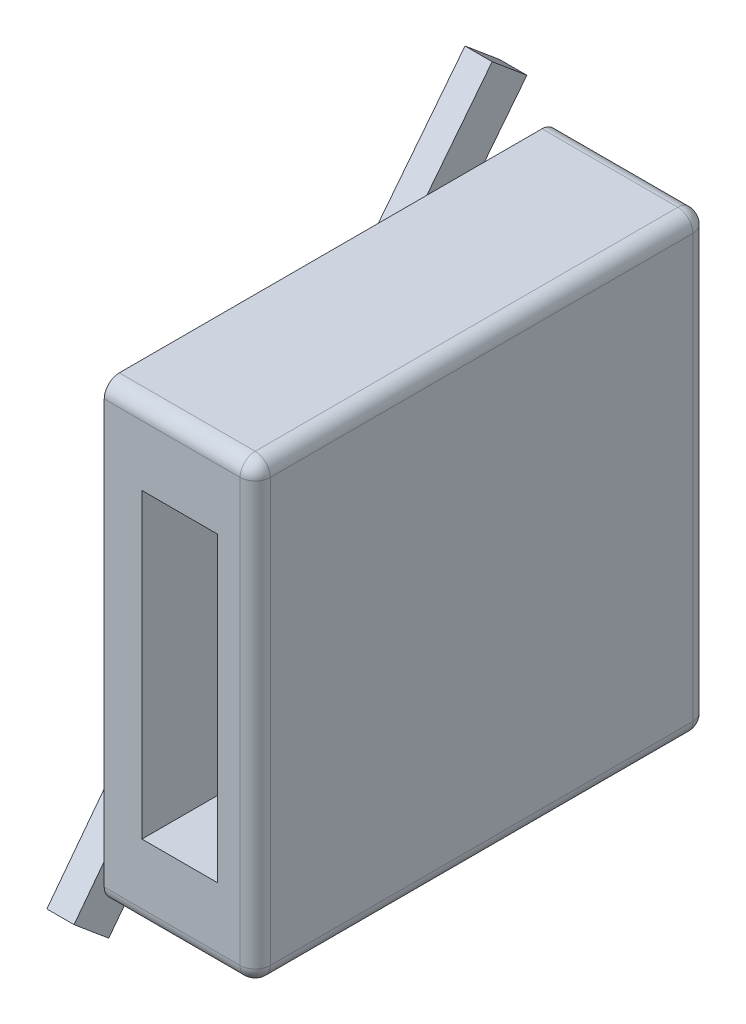
ISO-10303-21;
HEADER;
FILE_DESCRIPTION(('STEP AP214'),'2;1');
FILE_NAME('part.step','',(''),(''),'','','');
FILE_SCHEMA(('AUTOMOTIVE_DESIGN { 1 0 10303 214 1 1 1 1 }'));
ENDSEC;
DATA;
#1=APPLICATION_CONTEXT('core data for automotive mechanical design processes');
#2=APPLICATION_PROTOCOL_DEFINITION('international standard','automotive_design',2000,#1);
#3=PRODUCT_CONTEXT('',#1,'mechanical');
#4=PRODUCT('Part','Part','',(#3));
#5=PRODUCT_RELATED_PRODUCT_CATEGORY('part','',(#4));
#6=PRODUCT_DEFINITION_FORMATION('','',#4);
#7=PRODUCT_DEFINITION_CONTEXT('part definition',#1,'design');
#8=PRODUCT_DEFINITION('design','',#6,#7);
#9=PRODUCT_DEFINITION_SHAPE('','',#8);
#10=(LENGTH_UNIT() NAMED_UNIT(*) SI_UNIT(.MILLI.,.METRE.));
#11=(NAMED_UNIT(*) PLANE_ANGLE_UNIT() SI_UNIT($,.RADIAN.));
#12=(NAMED_UNIT(*) SI_UNIT($,.STERADIAN.) SOLID_ANGLE_UNIT());
#13=UNCERTAINTY_MEASURE_WITH_UNIT(LENGTH_MEASURE(1.E-05),#10,'distance_accuracy_value','');
#14=(GEOMETRIC_REPRESENTATION_CONTEXT(3) GLOBAL_UNCERTAINTY_ASSIGNED_CONTEXT((#13)) GLOBAL_UNIT_ASSIGNED_CONTEXT((#10,
#11,#12)) REPRESENTATION_CONTEXT('',''));
#15=CARTESIAN_POINT('',(0.,0.,0.));
#16=DIRECTION('',(0.,0.,1.));
#17=DIRECTION('',(1.,0.,0.));
#18=AXIS2_PLACEMENT_3D('',#15,#16,#17);
#19=CARTESIAN_POINT('',(-6.,0.,0.));
#20=DIRECTION('',(1.,0.,0.));
#21=DIRECTION('',(0.,0.,-1.));
#22=AXIS2_PLACEMENT_3D('',#19,#20,#21);
#23=CYLINDRICAL_SURFACE('',#22,2.);
#24=DIRECTION('',(1.,0.,0.));
#25=VECTOR('',#24,1.);
#26=CARTESIAN_POINT('',(-3.8,1.97730393267592,0.30044826147661));
#27=LINE('',#26,#25);
#28=CARTESIAN_POINT('',(-3.8,1.97730393267593,0.30044826147661));
#29=VERTEX_POINT('',#28);
#30=CARTESIAN_POINT('',(-2.,1.97730393267593,0.300448261476609));
#31=VERTEX_POINT('',#30);
#32=EDGE_CURVE('E313',#29,#31,#27,.T.);
#33=ORIENTED_EDGE('',*,*,#32,.F.);
#34=CARTESIAN_POINT('',(-3.8,0.,0.));
#35=DIRECTION('',(1.,0.,0.));
#36=DIRECTION('',(0.,0.,-1.));
#37=AXIS2_PLACEMENT_3D('',#34,#35,#36);
#38=CIRCLE('',#37,2.);
#39=CARTESIAN_POINT('',(-3.8,0.0509287765563087,-1.99935145977851));
#40=VERTEX_POINT('',#39);
#41=EDGE_CURVE('E342',#29,#40,#38,.F.);
#42=ORIENTED_EDGE('',*,*,#41,.T.);
#43=DIRECTION('',(1.,0.,0.));
#44=VECTOR('',#43,1.);
#45=CARTESIAN_POINT('',(-3.8,0.0509287765563048,-1.99935145977851));
#46=LINE('',#45,#44);
#47=CARTESIAN_POINT('',(-2.,0.0509287765563048,-1.99935145977851));
#48=VERTEX_POINT('',#47);
#49=EDGE_CURVE('E324',#40,#48,#46,.T.);
#50=ORIENTED_EDGE('',*,*,#49,.T.);
#51=CARTESIAN_POINT('',(-2.,0.,0.));
#52=DIRECTION('',(1.,0.,0.));
#53=DIRECTION('',(0.,0.,-1.));
#54=AXIS2_PLACEMENT_3D('',#51,#52,#53);
#55=CIRCLE('',#54,2.);
#56=EDGE_CURVE('E334',#31,#48,#55,.F.);
#57=ORIENTED_EDGE('',*,*,#56,.F.);
#58=EDGE_LOOP('',(#33,#42,#50,#57));
#59=FACE_BOUND('',#58,.T.);
#60=CARTESIAN_POINT('',(-2.,-1.97730393267593,-0.300448261476609));
#61=VERTEX_POINT('',#60);
#62=CARTESIAN_POINT('',(-2.,-0.0509287765563049,1.99935145977851));
#63=VERTEX_POINT('',#62);
#64=EDGE_CURVE('E338',#61,#63,#55,.F.);
#65=ORIENTED_EDGE('',*,*,#64,.F.);
#66=DIRECTION('',(1.,0.,0.));
#67=VECTOR('',#66,1.);
#68=CARTESIAN_POINT('',(-3.8,-1.97730393267592,-0.30044826147661));
#69=LINE('',#68,#67);
#70=CARTESIAN_POINT('',(-3.8,-1.97730393267593,-0.300448261476609));
#71=VERTEX_POINT('',#70);
#72=EDGE_CURVE('E281',#71,#61,#69,.T.);
#73=ORIENTED_EDGE('',*,*,#72,.F.);
#74=CARTESIAN_POINT('',(-3.8,-0.0509287765563089,1.99935145977851));
#75=VERTEX_POINT('',#74);
#76=EDGE_CURVE('E343',#71,#75,#38,.F.);
#77=ORIENTED_EDGE('',*,*,#76,.T.);
#78=DIRECTION('',(1.,0.,0.));
#79=VECTOR('',#78,1.);
#80=CARTESIAN_POINT('',(-3.8,-0.0509287765563049,1.99935145977851));
#81=LINE('',#80,#79);
#82=EDGE_CURVE('E310',#75,#63,#81,.T.);
#83=ORIENTED_EDGE('',*,*,#82,.T.);
#84=EDGE_LOOP('',(#65,#73,#77,#83));
#85=FACE_BOUND('',#84,.T.);
#86=CARTESIAN_POINT('',(0.,0.,0.));
#87=DIRECTION('',(1.,0.,0.));
#88=DIRECTION('',(0.,0.,-1.));
#89=AXIS2_PLACEMENT_3D('',#86,#87,#88);
#90=CIRCLE('',#89,2.);
#91=CARTESIAN_POINT('',(0.,0.,-2.));
#92=VERTEX_POINT('',#91);
#93=EDGE_CURVE('E306',#92,#92,#90,.T.);
#94=ORIENTED_EDGE('',*,*,#93,.F.);
#95=EDGE_LOOP('',(#94));
#96=FACE_BOUND('',#95,.T.);
#97=CARTESIAN_POINT('',(-6.,0.,0.));
#98=DIRECTION('',(1.,0.,0.));
#99=DIRECTION('',(0.,0.,-1.));
#100=AXIS2_PLACEMENT_3D('',#97,#98,#99);
#101=CIRCLE('',#100,2.);
#102=CARTESIAN_POINT('',(-6.,0.,-2.));
#103=VERTEX_POINT('',#102);
#104=EDGE_CURVE('E330',#103,#103,#101,.T.);
#105=ORIENTED_EDGE('',*,*,#104,.T.);
#106=EDGE_LOOP('',(#105));
#107=FACE_BOUND('',#106,.T.);
#108=ADVANCED_FACE('F40',(#59,#85,#96,#107),#23,.T.);
#109=CARTESIAN_POINT('',(-6.,0.,0.));
#110=DIRECTION('',(1.,0.,0.));
#111=DIRECTION('',(0.,0.,-1.));
#112=AXIS2_PLACEMENT_3D('',#109,#110,#111);
#113=PLANE('',#112);
#114=ORIENTED_EDGE('',*,*,#104,.F.);
#115=EDGE_LOOP('',(#114));
#116=FACE_BOUND('',#115,.T.);
#117=ADVANCED_FACE('F507',(#116),#113,.F.);
#118=CARTESIAN_POINT('',(-3.8,17.1237069787867,-14.3432853738245));
#119=DIRECTION('',(0.,-0.766599907085064,0.642125052039844));
#120=DIRECTION('',(0.,-0.642125052039844,-0.766599907085064));
#121=AXIS2_PLACEMENT_3D('',#118,#119,#120);
#122=PLANE('',#121);
#123=DIRECTION('',(0.,-0.642125052039844,-0.766599907085064));
#124=VECTOR('',#123,1.);
#125=CARTESIAN_POINT('',(-2.,17.1237069787867,-14.3432853738245));
#126=LINE('',#125,#124);
#127=CARTESIAN_POINT('',(-2.,18.5,-12.7002002787448));
#128=VERTEX_POINT('',#127);
#129=CARTESIAN_POINT('',(-2.,16.5736248438805,-15.));
#130=VERTEX_POINT('',#129);
#131=EDGE_CURVE('E289',#128,#130,#126,.T.);
#132=ORIENTED_EDGE('',*,*,#131,.T.);
#133=DIRECTION('',(1.,0.,0.));
#134=VECTOR('',#133,1.);
#135=CARTESIAN_POINT('',(-3.8,16.5736248438805,-15.));
#136=LINE('',#135,#134);
#137=CARTESIAN_POINT('',(-3.8,16.5736248438805,-15.));
#138=VERTEX_POINT('',#137);
#139=EDGE_CURVE('E321',#138,#130,#136,.T.);
#140=ORIENTED_EDGE('',*,*,#139,.F.);
#141=DIRECTION('',(0.,-0.642125052039844,-0.766599907085064));
#142=VECTOR('',#141,1.);
#143=CARTESIAN_POINT('',(-3.8,17.1237069787867,-14.3432853738245));
#144=LINE('',#143,#142);
#145=CARTESIAN_POINT('',(-3.8,18.5,-12.7002002787448));
#146=VERTEX_POINT('',#145);
#147=EDGE_CURVE('E267',#146,#138,#144,.T.);
#148=ORIENTED_EDGE('',*,*,#147,.F.);
#149=DIRECTION('',(1.,0.,0.));
#150=VECTOR('',#149,1.);
#151=CARTESIAN_POINT('',(-3.8,18.5,-12.7002002787448));
#152=LINE('',#151,#150);
#153=EDGE_CURVE('E317',#146,#128,#152,.T.);
#154=ORIENTED_EDGE('',*,*,#153,.T.);
#155=EDGE_LOOP('',(#132,#140,#148,#154));
#156=FACE_BOUND('',#155,.T.);
#157=ADVANCED_FACE('F515',(#156),#122,.F.);
#158=CARTESIAN_POINT('',(-3.8,0.,0.));
#159=DIRECTION('',(1.,0.,0.));
#160=DIRECTION('',(0.,0.,-1.));
#161=AXIS2_PLACEMENT_3D('',#158,#159,#160);
#162=PLANE('',#161);
#163=ORIENTED_EDGE('',*,*,#41,.F.);
#164=DIRECTION('',(0.,0.78588997387051,-0.618366354978834));
#165=VECTOR('',#164,1.);
#166=CARTESIAN_POINT('',(-3.8,0.902083661226397,1.14647004844643));
#167=LINE('',#166,#165);
#168=EDGE_CURVE('E270',#29,#146,#167,.T.);
#169=ORIENTED_EDGE('',*,*,#168,.T.);
#170=ORIENTED_EDGE('',*,*,#147,.T.);
#171=DIRECTION('',(0.,0.78588997387051,-0.618366354978834));
#172=VECTOR('',#171,1.);
#173=CARTESIAN_POINT('',(-3.8,-0.952146677177534,-1.21009579713236));
#174=LINE('',#173,#172);
#175=EDGE_CURVE('E262',#40,#138,#174,.T.);
#176=ORIENTED_EDGE('',*,*,#175,.F.);
#177=EDGE_LOOP('',(#163,#169,#170,#176));
#178=FACE_BOUND('',#177,.T.);
#179=ADVANCED_FACE('F732',(#178),#162,.F.);
#180=CARTESIAN_POINT('',(-2.,0.,0.));
#181=DIRECTION('',(1.,0.,0.));
#182=DIRECTION('',(0.,0.,-1.));
#183=AXIS2_PLACEMENT_3D('',#180,#181,#182);
#184=PLANE('',#183);
#185=DIRECTION('',(0.,0.78588997387051,-0.618366354978834));
#186=VECTOR('',#185,1.);
#187=CARTESIAN_POINT('',(-2.,0.902083661226397,1.14647004844643));
#188=LINE('',#187,#186);
#189=EDGE_CURVE('E293',#31,#128,#188,.T.);
#190=ORIENTED_EDGE('',*,*,#189,.F.);
#191=ORIENTED_EDGE('',*,*,#56,.T.);
#192=DIRECTION('',(0.,0.78588997387051,-0.618366354978834));
#193=VECTOR('',#192,1.);
#194=CARTESIAN_POINT('',(-2.,-0.952146677177534,-1.21009579713236));
#195=LINE('',#194,#193);
#196=EDGE_CURVE('E285',#48,#130,#195,.T.);
#197=ORIENTED_EDGE('',*,*,#196,.T.);
#198=ORIENTED_EDGE('',*,*,#131,.F.);
#199=EDGE_LOOP('',(#190,#191,#197,#198));
#200=FACE_BOUND('',#199,.T.);
#201=ADVANCED_FACE('F722',(#200),#184,.T.);
#202=CARTESIAN_POINT('',(-3.8,-0.952146677177534,-1.21009579713236));
#203=DIRECTION('',(0.,-0.618366354978834,-0.78588997387051));
#204=DIRECTION('',(0.,0.78588997387051,-0.618366354978834));
#205=AXIS2_PLACEMENT_3D('',#202,#203,#204);
#206=PLANE('',#205);
#207=ORIENTED_EDGE('',*,*,#196,.F.);
#208=ORIENTED_EDGE('',*,*,#49,.F.);
#209=ORIENTED_EDGE('',*,*,#175,.T.);
#210=ORIENTED_EDGE('',*,*,#139,.T.);
#211=EDGE_LOOP('',(#207,#208,#209,#210));
#212=FACE_BOUND('',#211,.T.);
#213=ADVANCED_FACE('F739',(#212),#206,.T.);
#214=CARTESIAN_POINT('',(-3.8,0.902083661226397,1.14647004844643));
#215=DIRECTION('',(0.,-0.618366354978834,-0.78588997387051));
#216=DIRECTION('',(0.,0.78588997387051,-0.618366354978834));
#217=AXIS2_PLACEMENT_3D('',#214,#215,#216);
#218=PLANE('',#217);
#219=ORIENTED_EDGE('',*,*,#189,.T.);
#220=ORIENTED_EDGE('',*,*,#153,.F.);
#221=ORIENTED_EDGE('',*,*,#168,.F.);
#222=ORIENTED_EDGE('',*,*,#32,.T.);
#223=EDGE_LOOP('',(#219,#220,#221,#222));
#224=FACE_BOUND('',#223,.T.);
#225=ADVANCED_FACE('F729',(#224),#218,.F.);
#226=ORIENTED_EDGE('',*,*,#76,.F.);
#227=DIRECTION('',(0.,-0.796204023316346,0.60502822517207));
#228=VECTOR('',#227,1.);
#229=CARTESIAN_POINT('',(-3.8,-0.868543914619886,-1.14298495586815));
#230=LINE('',#229,#228);
#231=CARTESIAN_POINT('',(-3.8,-19.0858754716355,12.7002002787449));
#232=VERTEX_POINT('',#231);
#233=EDGE_CURVE('E259',#71,#232,#230,.T.);
#234=ORIENTED_EDGE('',*,*,#233,.T.);
#235=DIRECTION('',(0.,-0.642125052039872,-0.76659990708504));
#236=VECTOR('',#235,1.);
#237=CARTESIAN_POINT('',(-3.8,-17.4680115912076,14.6316843354287));
#238=LINE('',#237,#236);
#239=CARTESIAN_POINT('',(-3.8,-17.1595003155159,15.));
#240=VERTEX_POINT('',#239);
#241=EDGE_CURVE('E277',#240,#232,#238,.T.);
#242=ORIENTED_EDGE('',*,*,#241,.F.);
#243=DIRECTION('',(0.,-0.796204023316346,0.60502822517207));
#244=VECTOR('',#243,1.);
#245=CARTESIAN_POINT('',(-3.8,0.944496450754903,1.24293684626893));
#246=LINE('',#245,#244);
#247=EDGE_CURVE('E273',#75,#240,#246,.T.);
#248=ORIENTED_EDGE('',*,*,#247,.F.);
#249=EDGE_LOOP('',(#226,#234,#242,#248));
#250=FACE_BOUND('',#249,.T.);
#251=ADVANCED_FACE('F719',(#250),#162,.F.);
#252=DIRECTION('',(0.,-0.796204023316346,0.60502822517207));
#253=VECTOR('',#252,1.);
#254=CARTESIAN_POINT('',(-2.,-0.868543914619886,-1.14298495586815));
#255=LINE('',#254,#253);
#256=CARTESIAN_POINT('',(-2.,-19.0858754716355,12.7002002787449));
#257=VERTEX_POINT('',#256);
#258=EDGE_CURVE('E258',#61,#257,#255,.T.);
#259=ORIENTED_EDGE('',*,*,#258,.F.);
#260=ORIENTED_EDGE('',*,*,#64,.T.);
#261=DIRECTION('',(0.,-0.796204023316346,0.60502822517207));
#262=VECTOR('',#261,1.);
#263=CARTESIAN_POINT('',(-2.,0.944496450754903,1.24293684626893));
#264=LINE('',#263,#262);
#265=CARTESIAN_POINT('',(-2.,-17.1595003155159,15.));
#266=VERTEX_POINT('',#265);
#267=EDGE_CURVE('E296',#63,#266,#264,.T.);
#268=ORIENTED_EDGE('',*,*,#267,.T.);
#269=DIRECTION('',(0.,-0.642125052039872,-0.76659990708504));
#270=VECTOR('',#269,1.);
#271=CARTESIAN_POINT('',(-2.,-17.4680115912076,14.6316843354287));
#272=LINE('',#271,#270);
#273=EDGE_CURVE('E263',#266,#257,#272,.T.);
#274=ORIENTED_EDGE('',*,*,#273,.T.);
#275=EDGE_LOOP('',(#259,#260,#268,#274));
#276=FACE_BOUND('',#275,.T.);
#277=ADVANCED_FACE('F711',(#276),#184,.T.);
#278=CARTESIAN_POINT('',(-3.8,-0.868543914619886,-1.14298495586815));
#279=DIRECTION('',(0.,0.60502822517207,0.796204023316345));
#280=DIRECTION('',(0.,-0.796204023316346,0.60502822517207));
#281=AXIS2_PLACEMENT_3D('',#278,#279,#280);
#282=PLANE('',#281);
#283=ORIENTED_EDGE('',*,*,#258,.T.);
#284=DIRECTION('',(1.,0.,0.));
#285=VECTOR('',#284,1.);
#286=CARTESIAN_POINT('',(-3.8,-19.0858754716355,12.7002002787449));
#287=LINE('',#286,#285);
#288=EDGE_CURVE('E303',#232,#257,#287,.T.);
#289=ORIENTED_EDGE('',*,*,#288,.F.);
#290=ORIENTED_EDGE('',*,*,#233,.F.);
#291=ORIENTED_EDGE('',*,*,#72,.T.);
#292=EDGE_LOOP('',(#283,#289,#290,#291));
#293=FACE_BOUND('',#292,.T.);
#294=ADVANCED_FACE('F702',(#293),#282,.F.);
#295=CARTESIAN_POINT('',(-3.8,-17.4680115912076,14.6316843354287));
#296=DIRECTION('',(0.,-0.76659990708504,0.642125052039872));
#297=DIRECTION('',(0.,-0.642125052039872,-0.76659990708504));
#298=AXIS2_PLACEMENT_3D('',#295,#296,#297);
#299=PLANE('',#298);
#300=ORIENTED_EDGE('',*,*,#273,.F.);
#301=DIRECTION('',(1.,0.,0.));
#302=VECTOR('',#301,1.);
#303=CARTESIAN_POINT('',(-3.8,-17.1595003155159,15.));
#304=LINE('',#303,#302);
#305=EDGE_CURVE('E307',#240,#266,#304,.T.);
#306=ORIENTED_EDGE('',*,*,#305,.F.);
#307=ORIENTED_EDGE('',*,*,#241,.T.);
#308=ORIENTED_EDGE('',*,*,#288,.T.);
#309=EDGE_LOOP('',(#300,#306,#307,#308));
#310=FACE_BOUND('',#309,.T.);
#311=ADVANCED_FACE('F693',(#310),#299,.T.);
#312=CARTESIAN_POINT('',(-3.8,0.944496450754903,1.24293684626893));
#313=DIRECTION('',(0.,0.60502822517207,0.796204023316345));
#314=DIRECTION('',(0.,-0.796204023316345,0.60502822517207));
#315=AXIS2_PLACEMENT_3D('',#312,#313,#314);
#316=PLANE('',#315);
#317=ORIENTED_EDGE('',*,*,#267,.F.);
#318=ORIENTED_EDGE('',*,*,#82,.F.);
#319=ORIENTED_EDGE('',*,*,#247,.T.);
#320=ORIENTED_EDGE('',*,*,#305,.T.);
#321=EDGE_LOOP('',(#317,#318,#319,#320));
#322=FACE_BOUND('',#321,.T.);
#323=ADVANCED_FACE('F685',(#322),#316,.T.);
#324=CARTESIAN_POINT('',(10.,-15.,15.));
#325=DIRECTION('',(0.,0.,-1.));
#326=DIRECTION('',(0.,1.,0.));
#327=AXIS2_PLACEMENT_3D('',#324,#325,#326);
#328=PLANE('',#327);
#329=DIRECTION('',(1.,0.,0.));
#330=VECTOR('',#329,1.);
#331=CARTESIAN_POINT('',(7.5,-10.,15.));
#332=LINE('',#331,#330);
#333=CARTESIAN_POINT('',(2.5,-10.,15.));
#334=VERTEX_POINT('',#333);
#335=CARTESIAN_POINT('',(7.5,-10.,15.));
#336=VERTEX_POINT('',#335);
#337=EDGE_CURVE('E229',#334,#336,#332,.T.);
#338=ORIENTED_EDGE('',*,*,#337,.F.);
#339=DIRECTION('',(0.,-1.,0.));
#340=VECTOR('',#339,1.);
#341=CARTESIAN_POINT('',(2.5,-10.,15.));
#342=LINE('',#341,#340);
#343=CARTESIAN_POINT('',(2.5,10.,15.));
#344=VERTEX_POINT('',#343);
#345=EDGE_CURVE('E196',#344,#334,#342,.T.);
#346=ORIENTED_EDGE('',*,*,#345,.F.);
#347=DIRECTION('',(-1.,0.,0.));
#348=VECTOR('',#347,1.);
#349=CARTESIAN_POINT('',(7.5,10.,15.));
#350=LINE('',#349,#348);
#351=CARTESIAN_POINT('',(7.5,10.,15.));
#352=VERTEX_POINT('',#351);
#353=EDGE_CURVE('E216',#352,#344,#350,.T.);
#354=ORIENTED_EDGE('',*,*,#353,.F.);
#355=DIRECTION('',(0.,1.,0.));
#356=VECTOR('',#355,1.);
#357=CARTESIAN_POINT('',(7.5,-10.,15.));
#358=LINE('',#357,#356);
#359=EDGE_CURVE('E220',#336,#352,#358,.T.);
#360=ORIENTED_EDGE('',*,*,#359,.F.);
#361=EDGE_LOOP('',(#338,#346,#354,#360));
#362=FACE_BOUND('',#361,.T.);
#363=DIRECTION('',(0.,-1.,0.));
#364=VECTOR('',#363,1.);
#365=CARTESIAN_POINT('',(9.,15.,15.));
#366=LINE('',#365,#364);
#367=CARTESIAN_POINT('',(9.,-14.,15.));
#368=VERTEX_POINT('',#367);
#369=CARTESIAN_POINT('',(9.,14.,15.));
#370=VERTEX_POINT('',#369);
#371=EDGE_CURVE('E346',#368,#370,#366,.F.);
#372=ORIENTED_EDGE('',*,*,#371,.T.);
#373=DIRECTION('',(-1.,0.,0.));
#374=VECTOR('',#373,1.);
#375=CARTESIAN_POINT('',(10.,14.,15.));
#376=LINE('',#375,#374);
#377=CARTESIAN_POINT('',(0.,14.,15.));
#378=VERTEX_POINT('',#377);
#379=EDGE_CURVE('E352',#370,#378,#376,.T.);
#380=ORIENTED_EDGE('',*,*,#379,.T.);
#381=DIRECTION('',(0.,-1.,0.));
#382=VECTOR('',#381,1.);
#383=CARTESIAN_POINT('',(0.,-15.,15.));
#384=LINE('',#383,#382);
#385=CARTESIAN_POINT('',(0.,-14.,15.));
#386=VERTEX_POINT('',#385);
#387=EDGE_CURVE('E238',#378,#386,#384,.T.);
#388=ORIENTED_EDGE('',*,*,#387,.T.);
#389=DIRECTION('',(-1.,0.,0.));
#390=VECTOR('',#389,1.);
#391=CARTESIAN_POINT('',(10.,-14.,15.));
#392=LINE('',#391,#390);
#393=EDGE_CURVE('E349',#386,#368,#392,.F.);
#394=ORIENTED_EDGE('',*,*,#393,.T.);
#395=EDGE_LOOP('',(#372,#380,#388,#394));
#396=FACE_BOUND('',#395,.T.);
#397=ADVANCED_FACE('F678',(#362,#396),#328,.F.);
#398=CARTESIAN_POINT('',(10.,-15.,-15.));
#399=DIRECTION('',(0.,1.,0.));
#400=DIRECTION('',(0.,0.,1.));
#401=AXIS2_PLACEMENT_3D('',#398,#399,#400);
#402=PLANE('',#401);
#403=DIRECTION('',(0.,0.,-1.));
#404=VECTOR('',#403,1.);
#405=CARTESIAN_POINT('',(0.,-15.,-15.));
#406=LINE('',#405,#404);
#407=CARTESIAN_POINT('',(0.,-15.,14.));
#408=VERTEX_POINT('',#407);
#409=CARTESIAN_POINT('',(0.,-15.,-14.));
#410=VERTEX_POINT('',#409);
#411=EDGE_CURVE('E247',#408,#410,#406,.T.);
#412=ORIENTED_EDGE('',*,*,#411,.T.);
#413=DIRECTION('',(-1.,0.,0.));
#414=VECTOR('',#413,1.);
#415=CARTESIAN_POINT('',(10.,-15.,-14.));
#416=LINE('',#415,#414);
#417=CARTESIAN_POINT('',(9.,-15.,-14.));
#418=VERTEX_POINT('',#417);
#419=EDGE_CURVE('E11',#410,#418,#416,.F.);
#420=ORIENTED_EDGE('',*,*,#419,.T.);
#421=DIRECTION('',(0.,0.,-1.));
#422=VECTOR('',#421,1.);
#423=CARTESIAN_POINT('',(9.,-15.,15.));
#424=LINE('',#423,#422);
#425=CARTESIAN_POINT('',(9.,-15.,14.));
#426=VERTEX_POINT('',#425);
#427=EDGE_CURVE('E50',#418,#426,#424,.F.);
#428=ORIENTED_EDGE('',*,*,#427,.T.);
#429=DIRECTION('',(-1.,0.,0.));
#430=VECTOR('',#429,1.);
#431=CARTESIAN_POINT('',(10.,-15.,14.));
#432=LINE('',#431,#430);
#433=EDGE_CURVE('E399',#426,#408,#432,.T.);
#434=ORIENTED_EDGE('',*,*,#433,.T.);
#435=EDGE_LOOP('',(#412,#420,#428,#434));
#436=FACE_BOUND('',#435,.T.);
#437=ADVANCED_FACE('F670',(#436),#402,.F.);
#438=CARTESIAN_POINT('',(10.,-15.,-15.));
#439=DIRECTION('',(0.,0.,1.));
#440=DIRECTION('',(1.,0.,0.));
#441=AXIS2_PLACEMENT_3D('',#438,#439,#440);
#442=PLANE('',#441);
#443=DIRECTION('',(0.,1.,0.));
#444=VECTOR('',#443,1.);
#445=CARTESIAN_POINT('',(0.,-15.,-15.));
#446=LINE('',#445,#444);
#447=CARTESIAN_POINT('',(0.,-14.,-15.));
#448=VERTEX_POINT('',#447);
#449=CARTESIAN_POINT('',(0.,14.,-15.));
#450=VERTEX_POINT('',#449);
#451=EDGE_CURVE('E250',#448,#450,#446,.T.);
#452=ORIENTED_EDGE('',*,*,#451,.T.);
#453=DIRECTION('',(-1.,0.,0.));
#454=VECTOR('',#453,1.);
#455=CARTESIAN_POINT('',(10.,14.,-15.));
#456=LINE('',#455,#454);
#457=CARTESIAN_POINT('',(9.,14.,-15.));
#458=VERTEX_POINT('',#457);
#459=EDGE_CURVE('E383',#450,#458,#456,.F.);
#460=ORIENTED_EDGE('',*,*,#459,.T.);
#461=DIRECTION('',(0.,1.,0.));
#462=VECTOR('',#461,1.);
#463=CARTESIAN_POINT('',(9.,-15.,-15.));
#464=LINE('',#463,#462);
#465=CARTESIAN_POINT('',(9.,-14.,-15.));
#466=VERTEX_POINT('',#465);
#467=EDGE_CURVE('E377',#458,#466,#464,.F.);
#468=ORIENTED_EDGE('',*,*,#467,.T.);
#469=DIRECTION('',(-1.,0.,0.));
#470=VECTOR('',#469,1.);
#471=CARTESIAN_POINT('',(10.,-14.,-15.));
#472=LINE('',#471,#470);
#473=EDGE_CURVE('E380',#466,#448,#472,.T.);
#474=ORIENTED_EDGE('',*,*,#473,.T.);
#475=EDGE_LOOP('',(#452,#460,#468,#474));
#476=FACE_BOUND('',#475,.T.);
#477=DIRECTION('',(-1.,0.,0.));
#478=VECTOR('',#477,1.);
#479=CARTESIAN_POINT('',(7.5,10.,-15.));
#480=LINE('',#479,#478);
#481=CARTESIAN_POINT('',(7.5,10.,-15.));
#482=VERTEX_POINT('',#481);
#483=CARTESIAN_POINT('',(2.5,10.,-15.));
#484=VERTEX_POINT('',#483);
#485=EDGE_CURVE('E202',#482,#484,#480,.T.);
#486=ORIENTED_EDGE('',*,*,#485,.T.);
#487=DIRECTION('',(0.,-1.,0.));
#488=VECTOR('',#487,1.);
#489=CARTESIAN_POINT('',(2.5,-10.,-15.));
#490=LINE('',#489,#488);
#491=CARTESIAN_POINT('',(2.5,-10.,-15.));
#492=VERTEX_POINT('',#491);
#493=EDGE_CURVE('E193',#484,#492,#490,.T.);
#494=ORIENTED_EDGE('',*,*,#493,.T.);
#495=DIRECTION('',(1.,0.,0.));
#496=VECTOR('',#495,1.);
#497=CARTESIAN_POINT('',(7.5,-10.,-15.));
#498=LINE('',#497,#496);
#499=CARTESIAN_POINT('',(7.5,-10.,-15.));
#500=VERTEX_POINT('',#499);
#501=EDGE_CURVE('E206',#492,#500,#498,.T.);
#502=ORIENTED_EDGE('',*,*,#501,.T.);
#503=DIRECTION('',(0.,1.,0.));
#504=VECTOR('',#503,1.);
#505=CARTESIAN_POINT('',(7.5,-10.,-15.));
#506=LINE('',#505,#504);
#507=EDGE_CURVE('E211',#500,#482,#506,.T.);
#508=ORIENTED_EDGE('',*,*,#507,.T.);
#509=EDGE_LOOP('',(#486,#494,#502,#508));
#510=FACE_BOUND('',#509,.T.);
#511=ADVANCED_FACE('F213',(#476,#510),#442,.F.);
#512=CARTESIAN_POINT('',(10.,15.,-15.));
#513=DIRECTION('',(0.,-1.,0.));
#514=DIRECTION('',(0.,0.,-1.));
#515=AXIS2_PLACEMENT_3D('',#512,#513,#514);
#516=PLANE('',#515);
#517=DIRECTION('',(0.,0.,1.));
#518=VECTOR('',#517,1.);
#519=CARTESIAN_POINT('',(0.,15.,-15.));
#520=LINE('',#519,#518);
#521=CARTESIAN_POINT('',(0.,15.,-14.));
#522=VERTEX_POINT('',#521);
#523=CARTESIAN_POINT('',(0.,15.,14.));
#524=VERTEX_POINT('',#523);
#525=EDGE_CURVE('E254',#522,#524,#520,.T.);
#526=ORIENTED_EDGE('',*,*,#525,.T.);
#527=DIRECTION('',(-1.,0.,0.));
#528=VECTOR('',#527,1.);
#529=CARTESIAN_POINT('',(10.,15.,14.));
#530=LINE('',#529,#528);
#531=CARTESIAN_POINT('',(9.,15.,14.));
#532=VERTEX_POINT('',#531);
#533=EDGE_CURVE('E374',#524,#532,#530,.F.);
#534=ORIENTED_EDGE('',*,*,#533,.T.);
#535=DIRECTION('',(0.,0.,1.));
#536=VECTOR('',#535,1.);
#537=CARTESIAN_POINT('',(9.,15.,-15.));
#538=LINE('',#537,#536);
#539=CARTESIAN_POINT('',(9.,15.,-14.));
#540=VERTEX_POINT('',#539);
#541=EDGE_CURVE('E368',#532,#540,#538,.F.);
#542=ORIENTED_EDGE('',*,*,#541,.T.);
#543=DIRECTION('',(-1.,0.,0.));
#544=VECTOR('',#543,1.);
#545=CARTESIAN_POINT('',(10.,15.,-14.));
#546=LINE('',#545,#544);
#547=EDGE_CURVE('E371',#540,#522,#546,.T.);
#548=ORIENTED_EDGE('',*,*,#547,.T.);
#549=EDGE_LOOP('',(#526,#534,#542,#548));
#550=FACE_BOUND('',#549,.T.);
#551=ADVANCED_FACE('F654',(#550),#516,.F.);
#552=CARTESIAN_POINT('',(10.,0.,0.));
#553=DIRECTION('',(1.,0.,0.));
#554=DIRECTION('',(0.,0.,-1.));
#555=AXIS2_PLACEMENT_3D('',#552,#553,#554);
#556=PLANE('',#555);
#557=DIRECTION('',(0.,-1.,0.));
#558=VECTOR('',#557,1.);
#559=CARTESIAN_POINT('',(10.,-15.,14.));
#560=LINE('',#559,#558);
#561=CARTESIAN_POINT('',(10.,14.,14.));
#562=VERTEX_POINT('',#561);
#563=CARTESIAN_POINT('',(10.,-14.,14.));
#564=VERTEX_POINT('',#563);
#565=EDGE_CURVE('E389',#562,#564,#560,.T.);
#566=ORIENTED_EDGE('',*,*,#565,.T.);
#567=DIRECTION('',(0.,0.,-1.));
#568=VECTOR('',#567,1.);
#569=CARTESIAN_POINT('',(10.,-14.,-15.));
#570=LINE('',#569,#568);
#571=CARTESIAN_POINT('',(10.,-14.,-14.));
#572=VERTEX_POINT('',#571);
#573=EDGE_CURVE('E395',#564,#572,#570,.T.);
#574=ORIENTED_EDGE('',*,*,#573,.T.);
#575=DIRECTION('',(0.,1.,0.));
#576=VECTOR('',#575,1.);
#577=CARTESIAN_POINT('',(10.,15.,-14.));
#578=LINE('',#577,#576);
#579=CARTESIAN_POINT('',(10.,14.,-14.));
#580=VERTEX_POINT('',#579);
#581=EDGE_CURVE('E392',#572,#580,#578,.T.);
#582=ORIENTED_EDGE('',*,*,#581,.T.);
#583=DIRECTION('',(0.,0.,1.));
#584=VECTOR('',#583,1.);
#585=CARTESIAN_POINT('',(10.,14.,15.));
#586=LINE('',#585,#584);
#587=EDGE_CURVE('E386',#580,#562,#586,.T.);
#588=ORIENTED_EDGE('',*,*,#587,.T.);
#589=EDGE_LOOP('',(#566,#574,#582,#588));
#590=FACE_BOUND('',#589,.T.);
#591=ADVANCED_FACE('F482',(#590),#556,.T.);
#592=CARTESIAN_POINT('',(0.,0.,0.));
#593=DIRECTION('',(1.,0.,0.));
#594=DIRECTION('',(0.,0.,-1.));
#595=AXIS2_PLACEMENT_3D('',#592,#593,#594);
#596=PLANE('',#595);
#597=ORIENTED_EDGE('',*,*,#93,.T.);
#598=EDGE_LOOP('',(#597));
#599=FACE_BOUND('',#598,.T.);
#600=ORIENTED_EDGE('',*,*,#387,.F.);
#601=CARTESIAN_POINT('',(0.,14.,14.));
#602=DIRECTION('',(1.,0.,0.));
#603=DIRECTION('',(0.,0.,-1.));
#604=AXIS2_PLACEMENT_3D('',#601,#602,#603);
#605=CIRCLE('',#604,1.);
#606=EDGE_CURVE('E365',#378,#524,#605,.F.);
#607=ORIENTED_EDGE('',*,*,#606,.T.);
#608=ORIENTED_EDGE('',*,*,#525,.F.);
#609=CARTESIAN_POINT('',(0.,14.,-14.));
#610=DIRECTION('',(1.,0.,0.));
#611=DIRECTION('',(0.,0.,-1.));
#612=AXIS2_PLACEMENT_3D('',#609,#610,#611);
#613=CIRCLE('',#612,1.);
#614=EDGE_CURVE('E362',#522,#450,#613,.F.);
#615=ORIENTED_EDGE('',*,*,#614,.T.);
#616=ORIENTED_EDGE('',*,*,#451,.F.);
#617=CARTESIAN_POINT('',(0.,-14.,-14.));
#618=DIRECTION('',(1.,0.,0.));
#619=DIRECTION('',(0.,0.,-1.));
#620=AXIS2_PLACEMENT_3D('',#617,#618,#619);
#621=CIRCLE('',#620,1.);
#622=EDGE_CURVE('E359',#448,#410,#621,.F.);
#623=ORIENTED_EDGE('',*,*,#622,.T.);
#624=ORIENTED_EDGE('',*,*,#411,.F.);
#625=CARTESIAN_POINT('',(0.,-14.,14.));
#626=DIRECTION('',(1.,0.,0.));
#627=DIRECTION('',(0.,0.,-1.));
#628=AXIS2_PLACEMENT_3D('',#625,#626,#627);
#629=CIRCLE('',#628,1.);
#630=EDGE_CURVE('E356',#408,#386,#629,.F.);
#631=ORIENTED_EDGE('',*,*,#630,.T.);
#632=EDGE_LOOP('',(#600,#607,#608,#615,#616,#623,#624,#631));
#633=FACE_BOUND('',#632,.T.);
#634=ADVANCED_FACE('F462',(#599,#633),#596,.F.);
#635=CARTESIAN_POINT('',(2.5,-10.,-15.));
#636=DIRECTION('',(-1.,0.,0.));
#637=DIRECTION('',(0.,0.,1.));
#638=AXIS2_PLACEMENT_3D('',#635,#636,#637);
#639=PLANE('',#638);
#640=ORIENTED_EDGE('',*,*,#345,.T.);
#641=DIRECTION('',(0.,0.,1.));
#642=VECTOR('',#641,1.);
#643=CARTESIAN_POINT('',(2.5,-10.,-15.));
#644=LINE('',#643,#642);
#645=EDGE_CURVE('E189',#492,#334,#644,.T.);
#646=ORIENTED_EDGE('',*,*,#645,.F.);
#647=ORIENTED_EDGE('',*,*,#493,.F.);
#648=DIRECTION('',(0.,0.,1.));
#649=VECTOR('',#648,1.);
#650=CARTESIAN_POINT('',(2.5,10.,-15.));
#651=LINE('',#650,#649);
#652=EDGE_CURVE('E235',#484,#344,#651,.T.);
#653=ORIENTED_EDGE('',*,*,#652,.T.);
#654=EDGE_LOOP('',(#640,#646,#647,#653));
#655=FACE_BOUND('',#654,.T.);
#656=ADVANCED_FACE('F191',(#655),#639,.F.);
#657=CARTESIAN_POINT('',(7.5,10.,-15.));
#658=DIRECTION('',(0.,1.,0.));
#659=DIRECTION('',(-1.,0.,0.));
#660=AXIS2_PLACEMENT_3D('',#657,#658,#659);
#661=PLANE('',#660);
#662=ORIENTED_EDGE('',*,*,#353,.T.);
#663=ORIENTED_EDGE('',*,*,#652,.F.);
#664=ORIENTED_EDGE('',*,*,#485,.F.);
#665=DIRECTION('',(0.,0.,1.));
#666=VECTOR('',#665,1.);
#667=CARTESIAN_POINT('',(7.5,10.,-15.));
#668=LINE('',#667,#666);
#669=EDGE_CURVE('E239',#482,#352,#668,.T.);
#670=ORIENTED_EDGE('',*,*,#669,.T.);
#671=EDGE_LOOP('',(#662,#663,#664,#670));
#672=FACE_BOUND('',#671,.T.);
#673=ADVANCED_FACE('F622',(#672),#661,.F.);
#674=CARTESIAN_POINT('',(7.5,-10.,-15.));
#675=DIRECTION('',(1.,0.,0.));
#676=DIRECTION('',(0.,0.,-1.));
#677=AXIS2_PLACEMENT_3D('',#674,#675,#676);
#678=PLANE('',#677);
#679=ORIENTED_EDGE('',*,*,#359,.T.);
#680=ORIENTED_EDGE('',*,*,#669,.F.);
#681=ORIENTED_EDGE('',*,*,#507,.F.);
#682=DIRECTION('',(0.,0.,1.));
#683=VECTOR('',#682,1.);
#684=CARTESIAN_POINT('',(7.5,-10.,-15.));
#685=LINE('',#684,#683);
#686=EDGE_CURVE('E201',#500,#336,#685,.T.);
#687=ORIENTED_EDGE('',*,*,#686,.T.);
#688=EDGE_LOOP('',(#679,#680,#681,#687));
#689=FACE_BOUND('',#688,.T.);
#690=ADVANCED_FACE('F613',(#689),#678,.F.);
#691=CARTESIAN_POINT('',(7.5,-10.,-15.));
#692=DIRECTION('',(0.,-1.,0.));
#693=DIRECTION('',(0.,0.,-1.));
#694=AXIS2_PLACEMENT_3D('',#691,#692,#693);
#695=PLANE('',#694);
#696=ORIENTED_EDGE('',*,*,#337,.T.);
#697=ORIENTED_EDGE('',*,*,#686,.F.);
#698=ORIENTED_EDGE('',*,*,#501,.F.);
#699=ORIENTED_EDGE('',*,*,#645,.T.);
#700=EDGE_LOOP('',(#696,#697,#698,#699));
#701=FACE_BOUND('',#700,.T.);
#702=ADVANCED_FACE('F207',(#701),#695,.F.);
#703=CARTESIAN_POINT('',(10.,-14.,-14.));
#704=DIRECTION('',(-1.,0.,0.));
#705=DIRECTION('',(0.,0.,1.));
#706=AXIS2_PLACEMENT_3D('',#703,#704,#705);
#707=CYLINDRICAL_SURFACE('',#706,1.);
#708=CARTESIAN_POINT('',(9.,-14.,-14.));
#709=DIRECTION('',(1.,0.,0.));
#710=DIRECTION('',(0.,0.,-1.));
#711=AXIS2_PLACEMENT_3D('',#708,#709,#710);
#712=CIRCLE('',#711,1.);
#713=EDGE_CURVE('E44',#418,#466,#712,.T.);
#714=ORIENTED_EDGE('',*,*,#713,.F.);
#715=ORIENTED_EDGE('',*,*,#419,.F.);
#716=ORIENTED_EDGE('',*,*,#622,.F.);
#717=ORIENTED_EDGE('',*,*,#473,.F.);
#718=EDGE_LOOP('',(#714,#715,#716,#717));
#719=FACE_BOUND('',#718,.T.);
#720=ADVANCED_FACE('F42',(#719),#707,.T.);
#721=CARTESIAN_POINT('',(9.,-14.,-14.));
#722=DIRECTION('',(0.,0.,1.));
#723=DIRECTION('',(1.,0.,0.));
#724=AXIS2_PLACEMENT_3D('',#721,#722,#723);
#725=SPHERICAL_SURFACE('',#724,1.);
#726=CARTESIAN_POINT('',(9.,-14.,-14.));
#727=DIRECTION('',(0.,0.,-1.));
#728=DIRECTION('',(-1.,0.,0.));
#729=AXIS2_PLACEMENT_3D('',#726,#727,#728);
#730=CIRCLE('',#729,1.);
#731=EDGE_CURVE('E440',#418,#572,#730,.F.);
#732=ORIENTED_EDGE('',*,*,#731,.F.);
#733=ORIENTED_EDGE('',*,*,#713,.T.);
#734=CARTESIAN_POINT('',(9.,-14.,-14.));
#735=DIRECTION('',(0.,-1.,0.));
#736=DIRECTION('',(0.,0.,-1.));
#737=AXIS2_PLACEMENT_3D('',#734,#735,#736);
#738=CIRCLE('',#737,1.);
#739=EDGE_CURVE('E443',#572,#466,#738,.F.);
#740=ORIENTED_EDGE('',*,*,#739,.F.);
#741=EDGE_LOOP('',(#732,#733,#740));
#742=FACE_BOUND('',#741,.T.);
#743=ADVANCED_FACE('F453',(#742),#725,.T.);
#744=CARTESIAN_POINT('',(10.,14.,-14.));
#745=DIRECTION('',(-1.,0.,0.));
#746=DIRECTION('',(0.,0.,1.));
#747=AXIS2_PLACEMENT_3D('',#744,#745,#746);
#748=CYLINDRICAL_SURFACE('',#747,1.);
#749=ORIENTED_EDGE('',*,*,#614,.F.);
#750=ORIENTED_EDGE('',*,*,#547,.F.);
#751=CARTESIAN_POINT('',(9.,14.,-14.));
#752=DIRECTION('',(1.,0.,0.));
#753=DIRECTION('',(0.,0.,-1.));
#754=AXIS2_PLACEMENT_3D('',#751,#752,#753);
#755=CIRCLE('',#754,1.);
#756=EDGE_CURVE('E436',#458,#540,#755,.T.);
#757=ORIENTED_EDGE('',*,*,#756,.F.);
#758=ORIENTED_EDGE('',*,*,#459,.F.);
#759=EDGE_LOOP('',(#749,#750,#757,#758));
#760=FACE_BOUND('',#759,.T.);
#761=ADVANCED_FACE('F468',(#760),#748,.T.);
#762=CARTESIAN_POINT('',(9.,0.,-14.));
#763=DIRECTION('',(0.,-1.,0.));
#764=DIRECTION('',(0.,0.,-1.));
#765=AXIS2_PLACEMENT_3D('',#762,#763,#764);
#766=CYLINDRICAL_SURFACE('',#765,1.);
#767=ORIENTED_EDGE('',*,*,#739,.T.);
#768=ORIENTED_EDGE('',*,*,#467,.F.);
#769=CARTESIAN_POINT('',(9.,14.,-14.));
#770=DIRECTION('',(0.,1.,0.));
#771=DIRECTION('',(0.,0.,1.));
#772=AXIS2_PLACEMENT_3D('',#769,#770,#771);
#773=CIRCLE('',#772,1.);
#774=EDGE_CURVE('E432',#580,#458,#773,.T.);
#775=ORIENTED_EDGE('',*,*,#774,.F.);
#776=ORIENTED_EDGE('',*,*,#581,.F.);
#777=EDGE_LOOP('',(#767,#768,#775,#776));
#778=FACE_BOUND('',#777,.T.);
#779=ADVANCED_FACE('F471',(#778),#766,.T.);
#780=CARTESIAN_POINT('',(9.,-14.,0.));
#781=DIRECTION('',(0.,0.,1.));
#782=DIRECTION('',(0.,-1.,0.));
#783=AXIS2_PLACEMENT_3D('',#780,#781,#782);
#784=CYLINDRICAL_SURFACE('',#783,1.);
#785=ORIENTED_EDGE('',*,*,#731,.T.);
#786=ORIENTED_EDGE('',*,*,#573,.F.);
#787=CARTESIAN_POINT('',(9.,-14.,14.));
#788=DIRECTION('',(0.,0.,1.));
#789=DIRECTION('',(1.,0.,0.));
#790=AXIS2_PLACEMENT_3D('',#787,#788,#789);
#791=CIRCLE('',#790,1.);
#792=EDGE_CURVE('E428',#426,#564,#791,.T.);
#793=ORIENTED_EDGE('',*,*,#792,.F.);
#794=ORIENTED_EDGE('',*,*,#427,.F.);
#795=EDGE_LOOP('',(#785,#786,#793,#794));
#796=FACE_BOUND('',#795,.T.);
#797=ADVANCED_FACE('F495',(#796),#784,.T.);
#798=CARTESIAN_POINT('',(10.,-14.,14.));
#799=DIRECTION('',(-1.,0.,0.));
#800=DIRECTION('',(0.,0.,1.));
#801=AXIS2_PLACEMENT_3D('',#798,#799,#800);
#802=CYLINDRICAL_SURFACE('',#801,1.);
#803=ORIENTED_EDGE('',*,*,#630,.F.);
#804=ORIENTED_EDGE('',*,*,#433,.F.);
#805=CARTESIAN_POINT('',(9.,-14.,14.));
#806=DIRECTION('',(1.,0.,0.));
#807=DIRECTION('',(0.,0.,-1.));
#808=AXIS2_PLACEMENT_3D('',#805,#806,#807);
#809=CIRCLE('',#808,1.);
#810=EDGE_CURVE('E424',#368,#426,#809,.T.);
#811=ORIENTED_EDGE('',*,*,#810,.F.);
#812=ORIENTED_EDGE('',*,*,#393,.F.);
#813=EDGE_LOOP('',(#803,#804,#811,#812));
#814=FACE_BOUND('',#813,.T.);
#815=ADVANCED_FACE('F497',(#814),#802,.T.);
#816=CARTESIAN_POINT('',(9.,14.,-14.));
#817=DIRECTION('',(0.,0.,1.));
#818=DIRECTION('',(1.,0.,0.));
#819=AXIS2_PLACEMENT_3D('',#816,#817,#818);
#820=SPHERICAL_SURFACE('',#819,1.);
#821=ORIENTED_EDGE('',*,*,#774,.T.);
#822=ORIENTED_EDGE('',*,*,#756,.T.);
#823=CARTESIAN_POINT('',(9.,14.,-14.));
#824=DIRECTION('',(0.,0.,-1.));
#825=DIRECTION('',(-1.,0.,0.));
#826=AXIS2_PLACEMENT_3D('',#823,#824,#825);
#827=CIRCLE('',#826,1.);
#828=EDGE_CURVE('E420',#580,#540,#827,.F.);
#829=ORIENTED_EDGE('',*,*,#828,.F.);
#830=EDGE_LOOP('',(#821,#822,#829));
#831=FACE_BOUND('',#830,.T.);
#832=ADVANCED_FACE('F475',(#831),#820,.T.);
#833=CARTESIAN_POINT('',(9.,-14.,14.));
#834=DIRECTION('',(0.,0.,1.));
#835=DIRECTION('',(1.,0.,0.));
#836=AXIS2_PLACEMENT_3D('',#833,#834,#835);
#837=SPHERICAL_SURFACE('',#836,1.);
#838=ORIENTED_EDGE('',*,*,#810,.T.);
#839=ORIENTED_EDGE('',*,*,#792,.T.);
#840=CARTESIAN_POINT('',(9.,-14.,14.));
#841=DIRECTION('',(0.,-1.,0.));
#842=DIRECTION('',(0.,0.,-1.));
#843=AXIS2_PLACEMENT_3D('',#840,#841,#842);
#844=CIRCLE('',#843,1.);
#845=EDGE_CURVE('E416',#368,#564,#844,.F.);
#846=ORIENTED_EDGE('',*,*,#845,.F.);
#847=EDGE_LOOP('',(#838,#839,#846));
#848=FACE_BOUND('',#847,.T.);
#849=ADVANCED_FACE('F491',(#848),#837,.T.);
#850=CARTESIAN_POINT('',(9.,14.,0.));
#851=DIRECTION('',(0.,0.,-1.));
#852=DIRECTION('',(0.,1.,0.));
#853=AXIS2_PLACEMENT_3D('',#850,#851,#852);
#854=CYLINDRICAL_SURFACE('',#853,1.);
#855=ORIENTED_EDGE('',*,*,#828,.T.);
#856=ORIENTED_EDGE('',*,*,#541,.F.);
#857=CARTESIAN_POINT('',(9.,14.,14.));
#858=DIRECTION('',(0.,0.,1.));
#859=DIRECTION('',(1.,0.,0.));
#860=AXIS2_PLACEMENT_3D('',#857,#858,#859);
#861=CIRCLE('',#860,1.);
#862=EDGE_CURVE('E412',#562,#532,#861,.T.);
#863=ORIENTED_EDGE('',*,*,#862,.F.);
#864=ORIENTED_EDGE('',*,*,#587,.F.);
#865=EDGE_LOOP('',(#855,#856,#863,#864));
#866=FACE_BOUND('',#865,.T.);
#867=ADVANCED_FACE('F479',(#866),#854,.T.);
#868=CARTESIAN_POINT('',(9.,0.,14.));
#869=DIRECTION('',(0.,1.,0.));
#870=DIRECTION('',(0.,0.,1.));
#871=AXIS2_PLACEMENT_3D('',#868,#869,#870);
#872=CYLINDRICAL_SURFACE('',#871,1.);
#873=ORIENTED_EDGE('',*,*,#845,.T.);
#874=ORIENTED_EDGE('',*,*,#565,.F.);
#875=CARTESIAN_POINT('',(9.,14.,14.));
#876=DIRECTION('',(0.,1.,0.));
#877=DIRECTION('',(-1.,0.,0.));
#878=AXIS2_PLACEMENT_3D('',#875,#876,#877);
#879=CIRCLE('',#878,1.);
#880=EDGE_CURVE('E408',#370,#562,#879,.T.);
#881=ORIENTED_EDGE('',*,*,#880,.F.);
#882=ORIENTED_EDGE('',*,*,#371,.F.);
#883=EDGE_LOOP('',(#873,#874,#881,#882));
#884=FACE_BOUND('',#883,.T.);
#885=ADVANCED_FACE('F486',(#884),#872,.T.);
#886=CARTESIAN_POINT('',(9.,14.,14.));
#887=DIRECTION('',(0.,0.,1.));
#888=DIRECTION('',(1.,0.,0.));
#889=AXIS2_PLACEMENT_3D('',#886,#887,#888);
#890=SPHERICAL_SURFACE('',#889,1.);
#891=ORIENTED_EDGE('',*,*,#880,.T.);
#892=ORIENTED_EDGE('',*,*,#862,.T.);
#893=CARTESIAN_POINT('',(9.,14.,14.));
#894=DIRECTION('',(1.,0.,0.));
#895=DIRECTION('',(0.,0.,-1.));
#896=AXIS2_PLACEMENT_3D('',#893,#894,#895);
#897=CIRCLE('',#896,1.);
#898=EDGE_CURVE('E404',#370,#532,#897,.F.);
#899=ORIENTED_EDGE('',*,*,#898,.F.);
#900=EDGE_LOOP('',(#891,#892,#899));
#901=FACE_BOUND('',#900,.T.);
#902=ADVANCED_FACE('F524',(#901),#890,.T.);
#903=CARTESIAN_POINT('',(10.,14.,14.));
#904=DIRECTION('',(-1.,0.,0.));
#905=DIRECTION('',(0.,0.,1.));
#906=AXIS2_PLACEMENT_3D('',#903,#904,#905);
#907=CYLINDRICAL_SURFACE('',#906,1.);
#908=ORIENTED_EDGE('',*,*,#898,.T.);
#909=ORIENTED_EDGE('',*,*,#533,.F.);
#910=ORIENTED_EDGE('',*,*,#606,.F.);
#911=ORIENTED_EDGE('',*,*,#379,.F.);
#912=EDGE_LOOP('',(#908,#909,#910,#911));
#913=FACE_BOUND('',#912,.T.);
#914=ADVANCED_FACE('F521',(#913),#907,.T.);
#915=CLOSED_SHELL('',(#108,#117,#157,#179,#201,#213,#225,#251,#277,#294,#311,#323,#397,#437,
#511,#551,#591,#634,#656,#673,#690,#702,#720,#743,#761,#779,#797,#815,#832,#849,#867,#885,#902,#914));
#916=MANIFOLD_SOLID_BREP('B2',#915);
#917=ADVANCED_BREP_SHAPE_REPRESENTATION('',(#18,#916),#14);
#918=SHAPE_DEFINITION_REPRESENTATION(#9,#917);
ENDSEC;
END-ISO-10303-21;
